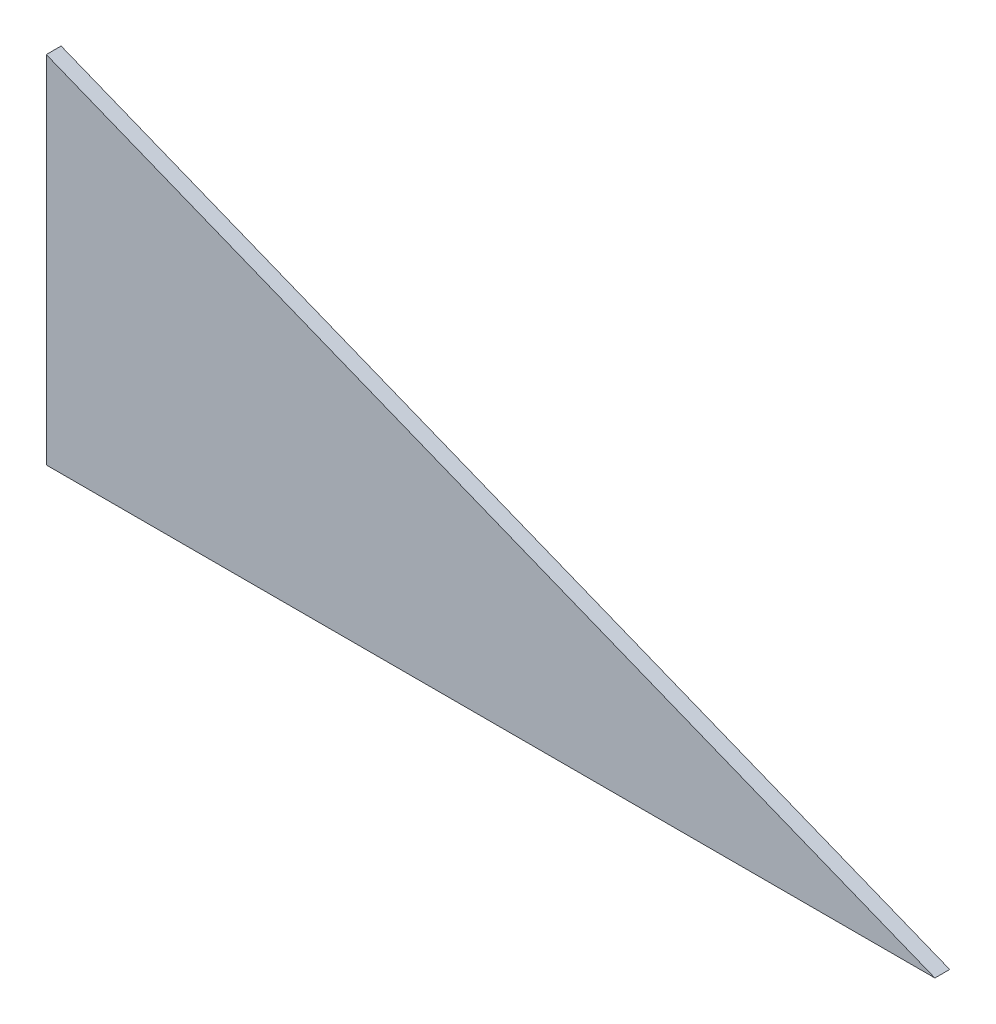
ISO-10303-21;
HEADER;
FILE_DESCRIPTION(('STEP AP214'),'2;1');
FILE_NAME('part.step','',(''),(''),'','','');
FILE_SCHEMA(('AUTOMOTIVE_DESIGN { 1 0 10303 214 1 1 1 1 }'));
ENDSEC;
DATA;
#1=APPLICATION_CONTEXT('core data for automotive mechanical design processes');
#2=APPLICATION_PROTOCOL_DEFINITION('international standard','automotive_design',2000,#1);
#3=PRODUCT_CONTEXT('',#1,'mechanical');
#4=PRODUCT('Part','Part','',(#3));
#5=PRODUCT_RELATED_PRODUCT_CATEGORY('part','',(#4));
#6=PRODUCT_DEFINITION_FORMATION('','',#4);
#7=PRODUCT_DEFINITION_CONTEXT('part definition',#1,'design');
#8=PRODUCT_DEFINITION('design','',#6,#7);
#9=PRODUCT_DEFINITION_SHAPE('','',#8);
#10=(LENGTH_UNIT() NAMED_UNIT(*) SI_UNIT(.MILLI.,.METRE.));
#11=(NAMED_UNIT(*) PLANE_ANGLE_UNIT() SI_UNIT($,.RADIAN.));
#12=(NAMED_UNIT(*) SI_UNIT($,.STERADIAN.) SOLID_ANGLE_UNIT());
#13=UNCERTAINTY_MEASURE_WITH_UNIT(LENGTH_MEASURE(1.E-05),#10,'distance_accuracy_value','');
#14=(GEOMETRIC_REPRESENTATION_CONTEXT(3) GLOBAL_UNCERTAINTY_ASSIGNED_CONTEXT((#13)) GLOBAL_UNIT_ASSIGNED_CONTEXT((#10,
#11,#12)) REPRESENTATION_CONTEXT('',''));
#15=CARTESIAN_POINT('',(0.,0.,0.));
#16=DIRECTION('',(0.,0.,1.));
#17=DIRECTION('',(1.,0.,0.));
#18=AXIS2_PLACEMENT_3D('',#15,#16,#17);
#19=CARTESIAN_POINT('',(0.,76.2,3.175));
#20=DIRECTION('',(-0.371390676354104,-0.928476690885259,0.));
#21=DIRECTION('',(0.928476690885259,-0.371390676354104,0.));
#22=AXIS2_PLACEMENT_3D('',#19,#20,#21);
#23=PLANE('',#22);
#24=DIRECTION('',(-0.928476690885259,0.371390676354104,0.));
#25=VECTOR('',#24,1.);
#26=CARTESIAN_POINT('',(0.,76.2,0.));
#27=LINE('',#26,#25);
#28=CARTESIAN_POINT('',(190.5,0.,0.));
#29=VERTEX_POINT('',#28);
#30=CARTESIAN_POINT('',(0.,76.2,0.));
#31=VERTEX_POINT('',#30);
#32=EDGE_CURVE('E82',#29,#31,#27,.T.);
#33=ORIENTED_EDGE('',*,*,#32,.T.);
#34=DIRECTION('',(0.,0.,-1.));
#35=VECTOR('',#34,1.);
#36=CARTESIAN_POINT('',(0.,76.2,3.175));
#37=LINE('',#36,#35);
#38=CARTESIAN_POINT('',(0.,76.2,3.175));
#39=VERTEX_POINT('',#38);
#40=EDGE_CURVE('E11',#39,#31,#37,.T.);
#41=ORIENTED_EDGE('',*,*,#40,.F.);
#42=DIRECTION('',(-0.928476690885259,0.371390676354104,0.));
#43=VECTOR('',#42,1.);
#44=CARTESIAN_POINT('',(0.,76.2,3.175));
#45=LINE('',#44,#43);
#46=CARTESIAN_POINT('',(190.5,0.,3.175));
#47=VERTEX_POINT('',#46);
#48=EDGE_CURVE('E75',#47,#39,#45,.T.);
#49=ORIENTED_EDGE('',*,*,#48,.F.);
#50=DIRECTION('',(0.,0.,-1.));
#51=VECTOR('',#50,1.);
#52=CARTESIAN_POINT('',(190.5,0.,3.175));
#53=LINE('',#52,#51);
#54=EDGE_CURVE('E83',#47,#29,#53,.T.);
#55=ORIENTED_EDGE('',*,*,#54,.T.);
#56=EDGE_LOOP('',(#33,#41,#49,#55));
#57=FACE_BOUND('',#56,.T.);
#58=ADVANCED_FACE('F35',(#57),#23,.F.);
#59=CARTESIAN_POINT('',(0.,76.2,3.175));
#60=DIRECTION('',(1.,0.,0.));
#61=DIRECTION('',(0.,1.,0.));
#62=AXIS2_PLACEMENT_3D('',#59,#60,#61);
#63=PLANE('',#62);
#64=DIRECTION('',(0.,-1.,0.));
#65=VECTOR('',#64,1.);
#66=CARTESIAN_POINT('',(0.,76.2,0.));
#67=LINE('',#66,#65);
#68=CARTESIAN_POINT('',(0.,0.,0.));
#69=VERTEX_POINT('',#68);
#70=EDGE_CURVE('E63',#31,#69,#67,.T.);
#71=ORIENTED_EDGE('',*,*,#70,.T.);
#72=DIRECTION('',(0.,0.,-1.));
#73=VECTOR('',#72,1.);
#74=CARTESIAN_POINT('',(0.,0.,3.175));
#75=LINE('',#74,#73);
#76=CARTESIAN_POINT('',(0.,0.,3.175));
#77=VERTEX_POINT('',#76);
#78=EDGE_CURVE('E43',#77,#69,#75,.T.);
#79=ORIENTED_EDGE('',*,*,#78,.F.);
#80=DIRECTION('',(0.,-1.,0.));
#81=VECTOR('',#80,1.);
#82=CARTESIAN_POINT('',(0.,76.2,3.175));
#83=LINE('',#82,#81);
#84=EDGE_CURVE('E71',#39,#77,#83,.T.);
#85=ORIENTED_EDGE('',*,*,#84,.F.);
#86=ORIENTED_EDGE('',*,*,#40,.T.);
#87=EDGE_LOOP('',(#71,#79,#85,#86));
#88=FACE_BOUND('',#87,.T.);
#89=ADVANCED_FACE('F72',(#88),#63,.F.);
#90=CARTESIAN_POINT('',(0.,0.,3.175));
#91=DIRECTION('',(0.,1.,0.));
#92=DIRECTION('',(0.,0.,1.));
#93=AXIS2_PLACEMENT_3D('',#90,#91,#92);
#94=PLANE('',#93);
#95=DIRECTION('',(1.,0.,0.));
#96=VECTOR('',#95,1.);
#97=CARTESIAN_POINT('',(0.,0.,0.));
#98=LINE('',#97,#96);
#99=EDGE_CURVE('E68',#69,#29,#98,.T.);
#100=ORIENTED_EDGE('',*,*,#99,.T.);
#101=ORIENTED_EDGE('',*,*,#54,.F.);
#102=DIRECTION('',(1.,0.,0.));
#103=VECTOR('',#102,1.);
#104=CARTESIAN_POINT('',(0.,0.,3.175));
#105=LINE('',#104,#103);
#106=EDGE_CURVE('E51',#77,#47,#105,.T.);
#107=ORIENTED_EDGE('',*,*,#106,.F.);
#108=ORIENTED_EDGE('',*,*,#78,.T.);
#109=EDGE_LOOP('',(#100,#101,#107,#108));
#110=FACE_BOUND('',#109,.T.);
#111=ADVANCED_FACE('F90',(#110),#94,.F.);
#112=CARTESIAN_POINT('',(0.,0.,3.175));
#113=DIRECTION('',(0.,0.,-1.));
#114=DIRECTION('',(-1.,0.,0.));
#115=AXIS2_PLACEMENT_3D('',#112,#113,#114);
#116=PLANE('',#115);
#117=ORIENTED_EDGE('',*,*,#48,.T.);
#118=ORIENTED_EDGE('',*,*,#84,.T.);
#119=ORIENTED_EDGE('',*,*,#106,.T.);
#120=EDGE_LOOP('',(#117,#118,#119));
#121=FACE_BOUND('',#120,.T.);
#122=ADVANCED_FACE('F78',(#121),#116,.F.);
#123=CARTESIAN_POINT('',(0.,0.,0.));
#124=DIRECTION('',(0.,0.,-1.));
#125=DIRECTION('',(-1.,0.,0.));
#126=AXIS2_PLACEMENT_3D('',#123,#124,#125);
#127=PLANE('',#126);
#128=ORIENTED_EDGE('',*,*,#32,.F.);
#129=ORIENTED_EDGE('',*,*,#99,.F.);
#130=ORIENTED_EDGE('',*,*,#70,.F.);
#131=EDGE_LOOP('',(#128,#129,#130));
#132=FACE_BOUND('',#131,.T.);
#133=ADVANCED_FACE('F91',(#132),#127,.T.);
#134=CLOSED_SHELL('',(#58,#89,#111,#122,#133));
#135=MANIFOLD_SOLID_BREP('B2',#134);
#136=ADVANCED_BREP_SHAPE_REPRESENTATION('',(#18,#135),#14);
#137=SHAPE_DEFINITION_REPRESENTATION(#9,#136);
ENDSEC;
END-ISO-10303-21;
